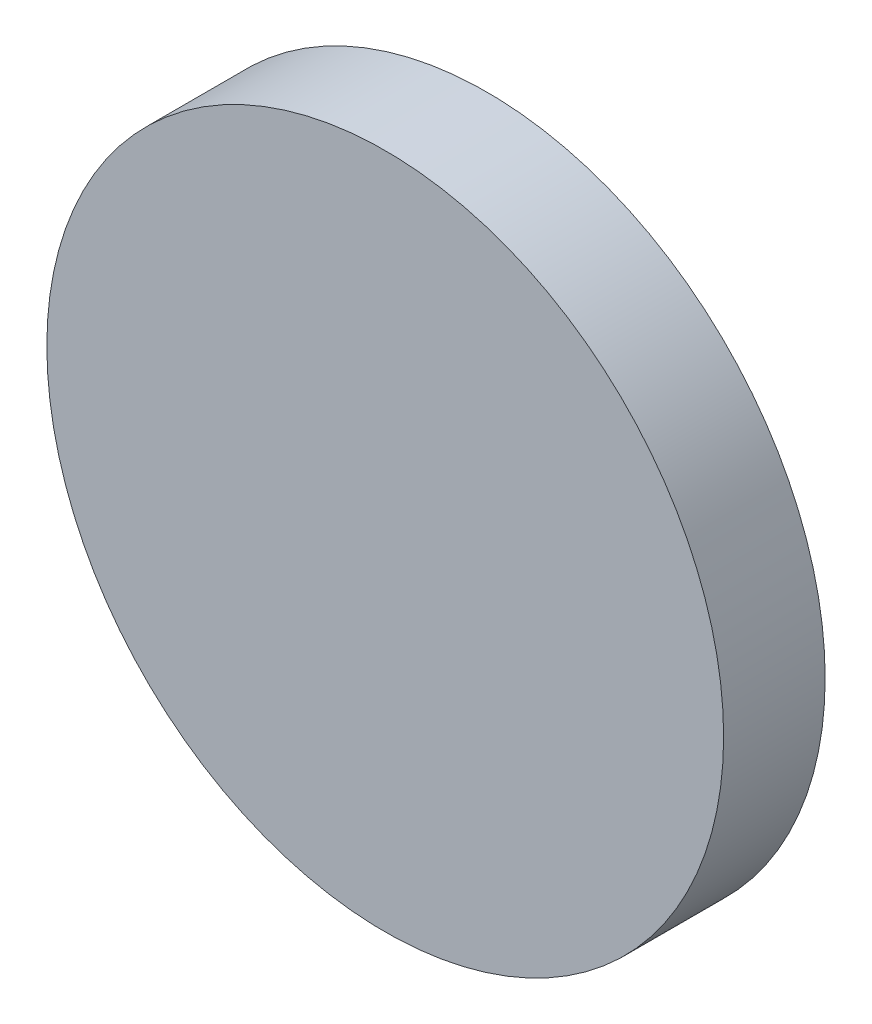
ISO-10303-21;
HEADER;
FILE_DESCRIPTION(('STEP AP214'),'2;1');
FILE_NAME('part.step','',(''),(''),'','','');
FILE_SCHEMA(('AUTOMOTIVE_DESIGN { 1 0 10303 214 1 1 1 1 }'));
ENDSEC;
DATA;
#1=APPLICATION_CONTEXT('core data for automotive mechanical design processes');
#2=APPLICATION_PROTOCOL_DEFINITION('international standard','automotive_design',2000,#1);
#3=PRODUCT_CONTEXT('',#1,'mechanical');
#4=PRODUCT('Part','Part','',(#3));
#5=PRODUCT_RELATED_PRODUCT_CATEGORY('part','',(#4));
#6=PRODUCT_DEFINITION_FORMATION('','',#4);
#7=PRODUCT_DEFINITION_CONTEXT('part definition',#1,'design');
#8=PRODUCT_DEFINITION('design','',#6,#7);
#9=PRODUCT_DEFINITION_SHAPE('','',#8);
#10=(LENGTH_UNIT() NAMED_UNIT(*) SI_UNIT(.MILLI.,.METRE.));
#11=(NAMED_UNIT(*) PLANE_ANGLE_UNIT() SI_UNIT($,.RADIAN.));
#12=(NAMED_UNIT(*) SI_UNIT($,.STERADIAN.) SOLID_ANGLE_UNIT());
#13=UNCERTAINTY_MEASURE_WITH_UNIT(LENGTH_MEASURE(1.E-05),#10,'distance_accuracy_value','');
#14=(GEOMETRIC_REPRESENTATION_CONTEXT(3) GLOBAL_UNCERTAINTY_ASSIGNED_CONTEXT((#13)) GLOBAL_UNIT_ASSIGNED_CONTEXT((#10,
#11,#12)) REPRESENTATION_CONTEXT('',''));
#15=CARTESIAN_POINT('',(0.,0.,0.));
#16=DIRECTION('',(0.,0.,1.));
#17=DIRECTION('',(1.,0.,0.));
#18=AXIS2_PLACEMENT_3D('',#15,#16,#17);
#19=CARTESIAN_POINT('',(0.,0.,15.));
#20=DIRECTION('',(0.,0.,1.));
#21=DIRECTION('',(1.,0.,0.));
#22=AXIS2_PLACEMENT_3D('',#19,#20,#21);
#23=PLANE('',#22);
#24=CARTESIAN_POINT('',(0.,0.,15.));
#25=DIRECTION('',(0.,0.,-1.));
#26=DIRECTION('',(-1.,0.,0.));
#27=AXIS2_PLACEMENT_3D('',#24,#25,#26);
#28=CIRCLE('',#27,50.);
#29=CARTESIAN_POINT('',(-50.,0.,15.));
#30=VERTEX_POINT('',#29);
#31=EDGE_CURVE('E56',#30,#30,#28,.T.);
#32=ORIENTED_EDGE('',*,*,#31,.F.);
#33=EDGE_LOOP('',(#32));
#34=FACE_BOUND('',#33,.T.);
#35=ADVANCED_FACE('F39',(#34),#23,.T.);
#36=CARTESIAN_POINT('',(0.,0.,10.));
#37=DIRECTION('',(0.,0.,1.));
#38=DIRECTION('',(1.,0.,0.));
#39=AXIS2_PLACEMENT_3D('',#36,#37,#38);
#40=PLANE('',#39);
#41=CARTESIAN_POINT('',(0.,0.,10.));
#42=DIRECTION('',(0.,0.,-1.));
#43=DIRECTION('',(-1.,0.,0.));
#44=AXIS2_PLACEMENT_3D('',#41,#42,#43);
#45=CIRCLE('',#44,40.);
#46=CARTESIAN_POINT('',(-40.,0.,10.));
#47=VERTEX_POINT('',#46);
#48=EDGE_CURVE('E10',#47,#47,#45,.T.);
#49=ORIENTED_EDGE('',*,*,#48,.T.);
#50=EDGE_LOOP('',(#49));
#51=FACE_BOUND('',#50,.T.);
#52=ADVANCED_FACE('F67',(#51),#40,.F.);
#53=CARTESIAN_POINT('',(0.,0.,0.));
#54=DIRECTION('',(0.,0.,-1.));
#55=DIRECTION('',(-1.,0.,0.));
#56=AXIS2_PLACEMENT_3D('',#53,#54,#55);
#57=CYLINDRICAL_SURFACE('',#56,40.);
#58=ORIENTED_EDGE('',*,*,#48,.F.);
#59=EDGE_LOOP('',(#58));
#60=FACE_BOUND('',#59,.T.);
#61=CARTESIAN_POINT('',(0.,0.,0.));
#62=DIRECTION('',(0.,0.,-1.));
#63=DIRECTION('',(-1.,0.,0.));
#64=AXIS2_PLACEMENT_3D('',#61,#62,#63);
#65=CIRCLE('',#64,40.);
#66=CARTESIAN_POINT('',(-40.,0.,0.));
#67=VERTEX_POINT('',#66);
#68=EDGE_CURVE('E46',#67,#67,#65,.T.);
#69=ORIENTED_EDGE('',*,*,#68,.T.);
#70=EDGE_LOOP('',(#69));
#71=FACE_BOUND('',#70,.T.);
#72=ADVANCED_FACE('F71',(#60,#71),#57,.F.);
#73=CARTESIAN_POINT('',(0.,0.,0.));
#74=DIRECTION('',(0.,0.,1.));
#75=DIRECTION('',(1.,0.,0.));
#76=AXIS2_PLACEMENT_3D('',#73,#74,#75);
#77=PLANE('',#76);
#78=ORIENTED_EDGE('',*,*,#68,.F.);
#79=EDGE_LOOP('',(#78));
#80=FACE_BOUND('',#79,.T.);
#81=CARTESIAN_POINT('',(0.,0.,0.));
#82=DIRECTION('',(0.,0.,-1.));
#83=DIRECTION('',(-1.,0.,0.));
#84=AXIS2_PLACEMENT_3D('',#81,#82,#83);
#85=CIRCLE('',#84,50.);
#86=CARTESIAN_POINT('',(-50.,0.,0.));
#87=VERTEX_POINT('',#86);
#88=EDGE_CURVE('E51',#87,#87,#85,.T.);
#89=ORIENTED_EDGE('',*,*,#88,.T.);
#90=EDGE_LOOP('',(#89));
#91=FACE_BOUND('',#90,.T.);
#92=ADVANCED_FACE('F75',(#80,#91),#77,.F.);
#93=CARTESIAN_POINT('',(0.,0.,0.));
#94=DIRECTION('',(0.,0.,-1.));
#95=DIRECTION('',(-1.,0.,0.));
#96=AXIS2_PLACEMENT_3D('',#93,#94,#95);
#97=CYLINDRICAL_SURFACE('',#96,50.);
#98=ORIENTED_EDGE('',*,*,#31,.T.);
#99=EDGE_LOOP('',(#98));
#100=FACE_BOUND('',#99,.T.);
#101=ORIENTED_EDGE('',*,*,#88,.F.);
#102=EDGE_LOOP('',(#101));
#103=FACE_BOUND('',#102,.T.);
#104=ADVANCED_FACE('F63',(#100,#103),#97,.T.);
#105=CLOSED_SHELL('',(#35,#52,#72,#92,#104));
#106=MANIFOLD_SOLID_BREP('B2',#105);
#107=ADVANCED_BREP_SHAPE_REPRESENTATION('',(#18,#106),#14);
#108=SHAPE_DEFINITION_REPRESENTATION(#9,#107);
ENDSEC;
END-ISO-10303-21;
